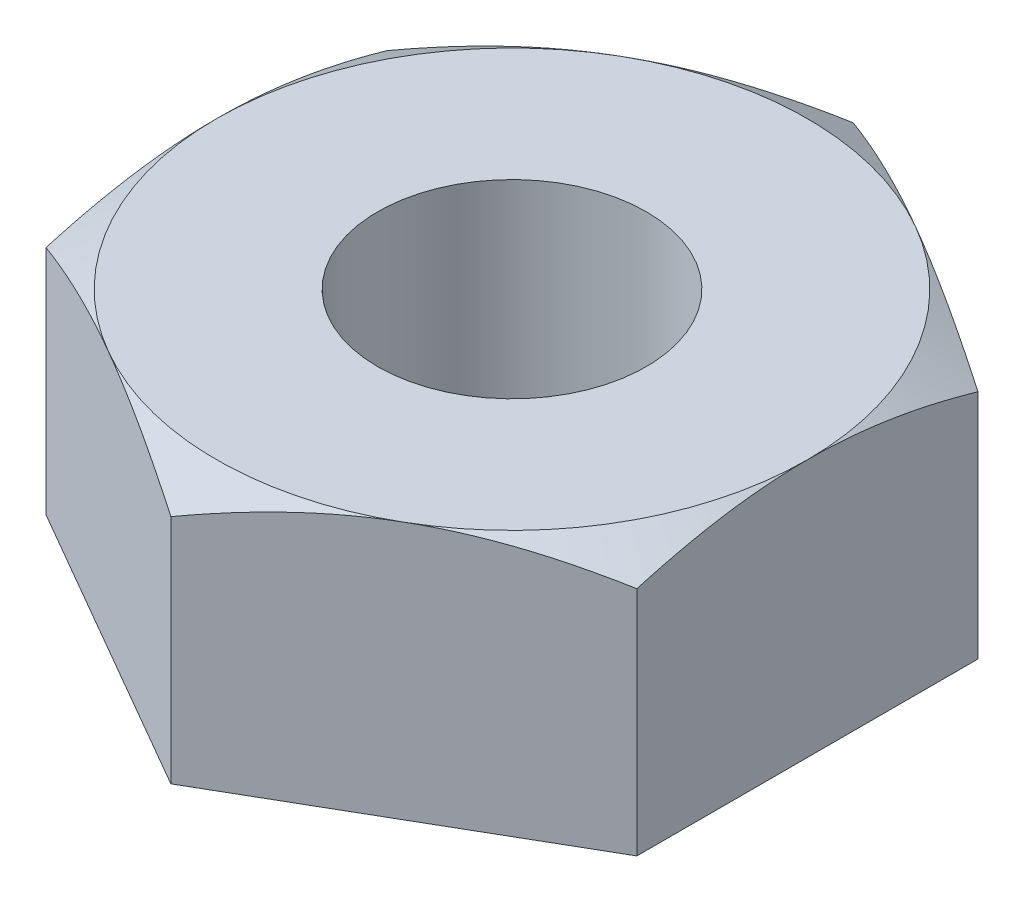
ISO-10303-21;
HEADER;
FILE_DESCRIPTION(('STEP AP214'),'2;1');
FILE_NAME('part.step','',(''),(''),'','','');
FILE_SCHEMA(('AUTOMOTIVE_DESIGN { 1 0 10303 214 1 1 1 1 }'));
ENDSEC;
DATA;
#1=APPLICATION_CONTEXT('core data for automotive mechanical design processes');
#2=APPLICATION_PROTOCOL_DEFINITION('international standard','automotive_design',2000,#1);
#3=PRODUCT_CONTEXT('',#1,'mechanical');
#4=PRODUCT('Part','Part','',(#3));
#5=PRODUCT_RELATED_PRODUCT_CATEGORY('part','',(#4));
#6=PRODUCT_DEFINITION_FORMATION('','',#4);
#7=PRODUCT_DEFINITION_CONTEXT('part definition',#1,'design');
#8=PRODUCT_DEFINITION('design','',#6,#7);
#9=PRODUCT_DEFINITION_SHAPE('','',#8);
#10=(LENGTH_UNIT() NAMED_UNIT(*) SI_UNIT(.MILLI.,.METRE.));
#11=(NAMED_UNIT(*) PLANE_ANGLE_UNIT() SI_UNIT($,.RADIAN.));
#12=(NAMED_UNIT(*) SI_UNIT($,.STERADIAN.) SOLID_ANGLE_UNIT());
#13=UNCERTAINTY_MEASURE_WITH_UNIT(LENGTH_MEASURE(1.E-05),#10,'distance_accuracy_value','');
#14=(GEOMETRIC_REPRESENTATION_CONTEXT(3) GLOBAL_UNCERTAINTY_ASSIGNED_CONTEXT((#13)) GLOBAL_UNIT_ASSIGNED_CONTEXT((#10,
#11,#12)) REPRESENTATION_CONTEXT('',''));
#15=CARTESIAN_POINT('',(0.,0.,0.));
#16=DIRECTION('',(0.,0.,1.));
#17=DIRECTION('',(1.,0.,0.));
#18=AXIS2_PLACEMENT_3D('',#15,#16,#17);
#19=CARTESIAN_POINT('',(2.75,-2.4,-1.58771324027147));
#20=DIRECTION('',(0.5,0.,-0.866025403784439));
#21=DIRECTION('',(-0.866025403784439,0.,-0.5));
#22=AXIS2_PLACEMENT_3D('',#19,#20,#21);
#23=PLANE('',#22);
#24=DIRECTION('',(0.,1.,0.));
#25=VECTOR('',#24,1.);
#26=CARTESIAN_POINT('',(0.,-2.4,-3.17542648054294));
#27=LINE('',#26,#25);
#28=CARTESIAN_POINT('',(0.,-2.4,-3.17542648054294));
#29=VERTEX_POINT('',#28);
#30=CARTESIAN_POINT('',(0.,-0.245620093061859,-3.17542648054294));
#31=VERTEX_POINT('',#30);
#32=EDGE_CURVE('E143',#29,#31,#27,.T.);
#33=ORIENTED_EDGE('',*,*,#32,.T.);
#34=CARTESIAN_POINT('',(-0.000199999999999868,-0.245686763364757,-3.17554195059678));
#35=CARTESIAN_POINT('',(0.120649220659906,-0.205387662249261,-3.10576962051743));
#36=CARTESIAN_POINT('',(0.242541602622634,-0.16873690259766,-3.03539502097908));
#37=CARTESIAN_POINT('',(0.488437126727892,-0.1047621829698,-2.89342717394439));
#38=CARTESIAN_POINT('',(0.612444638573855,-0.0774608556744965,-2.82183140359858));
#39=CARTESIAN_POINT('',(0.858922797975943,-0.0349617452941164,-2.67952717191843));
#40=CARTESIAN_POINT('',(0.981355518587416,-0.0194811186224576,-2.60884060771577));
#41=CARTESIAN_POINT('',(1.22679714236891,-0.000999397369940595,-2.46713482015519));
#42=CARTESIAN_POINT('',(1.34980515323291,0.00201700053740013,-2.39611611197038));
#43=CARTESIAN_POINT('',(1.57965878661079,-0.00425314542854663,-2.26341005486544));
#44=CARTESIAN_POINT('',(1.68653879125402,-0.0120001542767021,-2.20170285541369));
#45=CARTESIAN_POINT('',(1.89960246733475,-0.0365551810643541,-2.07869048467395));
#46=CARTESIAN_POINT('',(2.00578540164889,-0.0533715896505694,-2.01738573896434));
#47=CARTESIAN_POINT('',(2.21928848939318,-0.0954119223459548,-1.89411967378235));
#48=CARTESIAN_POINT('',(2.32658161614285,-0.120814080687229,-1.83217395817123));
#49=CARTESIAN_POINT('',(2.53956747928405,-0.178467225839979,-1.70920651275308));
#50=CARTESIAN_POINT('',(2.64526294502665,-0.210704663298979,-1.64818320715446));
#51=CARTESIAN_POINT('',(2.7502,-0.245686763364757,-1.58759777021763));
#52=B_SPLINE_CURVE_WITH_KNOTS('',3,(#34,#35,#36,#37,#38,#39,#40,#41,#42,#43,#44,#45,#46,#47,#48,
#49,#50,#51),.UNSPECIFIED.,.F.,.F.,(4,2,2,2,2,2,2,2,4),(0.,0.435912828725888,0.872873557116331,
1.29901931904671,1.72464171213573,2.09526089052937,2.46622354066374,2.84541551798557,
3.22386274754524),.UNSPECIFIED.);
#53=CARTESIAN_POINT('',(1.375,0.,-2.38156986040721));
#54=VERTEX_POINT('',#53);
#55=EDGE_CURVE('E59',#31,#54,#52,.T.);
#56=ORIENTED_EDGE('',*,*,#55,.T.);
#57=CARTESIAN_POINT('',(2.75,-0.245620093061859,-1.58771324027147));
#58=VERTEX_POINT('',#57);
#59=EDGE_CURVE('E222',#54,#58,#52,.T.);
#60=ORIENTED_EDGE('',*,*,#59,.T.);
#61=DIRECTION('',(0.,1.,0.));
#62=VECTOR('',#61,1.);
#63=CARTESIAN_POINT('',(2.75,-2.4,-1.58771324027147));
#64=LINE('',#63,#62);
#65=CARTESIAN_POINT('',(2.75,-2.4,-1.58771324027147));
#66=VERTEX_POINT('',#65);
#67=EDGE_CURVE('E135',#66,#58,#64,.T.);
#68=ORIENTED_EDGE('',*,*,#67,.F.);
#69=DIRECTION('',(-0.866025403784439,0.,-0.5));
#70=VECTOR('',#69,1.);
#71=CARTESIAN_POINT('',(2.75,-2.4,-1.58771324027147));
#72=LINE('',#71,#70);
#73=EDGE_CURVE('E350',#66,#29,#72,.T.);
#74=ORIENTED_EDGE('',*,*,#73,.T.);
#75=EDGE_LOOP('',(#33,#56,#60,#68,#74));
#76=FACE_BOUND('',#75,.T.);
#77=ADVANCED_FACE('F35',(#76),#23,.T.);
#78=CARTESIAN_POINT('',(2.75,-2.4,1.58771324027147));
#79=DIRECTION('',(1.,0.,0.));
#80=DIRECTION('',(0.,0.,-1.));
#81=AXIS2_PLACEMENT_3D('',#78,#79,#80);
#82=PLANE('',#81);
#83=ORIENTED_EDGE('',*,*,#67,.T.);
#84=CARTESIAN_POINT('',(2.75,-1.31594843960292,-4.21084949309676));
#85=CARTESIAN_POINT('',(2.75,-1.25759993615222,-4.0901089421409));
#86=CARTESIAN_POINT('',(2.75,-1.19983146511756,-3.96908292065509));
#87=CARTESIAN_POINT('',(2.75,-1.08578603842303,-3.72630558284843));
#88=CARTESIAN_POINT('',(2.75,-1.02950934100245,-3.604554145362));
#89=CARTESIAN_POINT('',(2.75,-0.918482443352741,-3.35951393034354));
#90=CARTESIAN_POINT('',(2.75,-0.863742821605822,-3.23622034236436));
#91=CARTESIAN_POINT('',(2.75,-0.75661477747644,-2.98861980138743));
#92=CARTESIAN_POINT('',(2.75,-0.704226232536751,-2.86431290161182));
#93=CARTESIAN_POINT('',(2.75,-0.601803572146113,-2.61294485887172));
#94=CARTESIAN_POINT('',(2.75,-0.551806257898383,-2.48586863815654));
#95=CARTESIAN_POINT('',(2.75,-0.455727408784592,-2.2302173217154));
#96=CARTESIAN_POINT('',(2.75,-0.409646309576964,-2.10164206103363));
#97=CARTESIAN_POINT('',(2.75,-0.322638077046225,-1.84305218799467));
#98=CARTESIAN_POINT('',(2.75,-0.281699986413882,-1.71304130052583));
#99=CARTESIAN_POINT('',(2.75,-0.206307307624344,-1.45117125062147));
#100=CARTESIAN_POINT('',(2.75,-0.171850669152763,-1.31931268690202));
#101=CARTESIAN_POINT('',(2.75,-0.111093671530901,-1.05365722480012));
#102=CARTESIAN_POINT('',(2.75,-0.0847954840951196,-0.91985982021759));
#103=CARTESIAN_POINT('',(2.75,-0.0421260371966102,-0.65065187403738));
#104=CARTESIAN_POINT('',(2.75,-0.0257547865105424,-0.515241331013594));
#105=CARTESIAN_POINT('',(2.75,-0.00438749654023712,-0.244373242869211));
#106=CARTESIAN_POINT('',(2.75,0.000680556773216223,-0.108921526377134));
#107=CARTESIAN_POINT('',(2.75,-0.00082779563267177,0.161887058855133));
#108=CARTESIAN_POINT('',(2.75,-0.00740117868555346,0.297243943089639));
#109=CARTESIAN_POINT('',(2.75,-0.0281041300468431,0.528385436717542));
#110=CARTESIAN_POINT('',(2.75,-0.0395376410301874,0.624425050137502));
#111=CARTESIAN_POINT('',(2.75,-0.0675217196133503,0.815762399811549));
#112=CARTESIAN_POINT('',(2.75,-0.0840730942276818,0.911060016631973));
#113=CARTESIAN_POINT('',(2.75,-0.140535361278285,1.19576218748918));
#114=CARTESIAN_POINT('',(2.75,-0.187239859417295,1.38383224738498));
#115=CARTESIAN_POINT('',(2.75,-0.26779249703058,1.66525048947487));
#116=CARTESIAN_POINT('',(2.75,-0.296803334995503,1.7600655624856));
#117=CARTESIAN_POINT('',(2.75,-0.357695648906591,1.94870609382218));
#118=CARTESIAN_POINT('',(2.75,-0.389575144878507,2.04253218553699));
#119=CARTESIAN_POINT('',(2.75,-0.455541418186453,2.22880240354988));
#120=CARTESIAN_POINT('',(2.75,-0.489614761455538,2.32125133588455));
#121=CARTESIAN_POINT('',(2.75,-0.559761368231115,2.50543192042632));
#122=CARTESIAN_POINT('',(2.75,-0.595835440037324,2.59716326539583));
#123=CARTESIAN_POINT('',(2.75,-0.63271244199749,2.6885629305335));
#124=B_SPLINE_CURVE_WITH_KNOTS('',3,(#84,#85,#86,#87,#88,#89,#90,#91,#92,#93,#94,#95,#96,#97,
#98,#99,#100,#101,#102,#103,#104,#105,#106,#107,#108,#109,#110,#111,#112,#113,#114,#115,#116,
#117,#118,#119,#120,#121,#122,#123),.UNSPECIFIED.,.F.,.F.,(4,2,2,2,2,2,2,2,2,2,2,2,2,2,2,2,2,2,
2,4),(0.,0.402305607365936,0.804680408536995,1.20935783819118,1.61401414820818,2.02363838185769,
2.43330812457348,2.842089694796,3.25074173456635,3.65950246109142,4.06826354901183,
4.47441284024649,4.8804566914117,5.17046846817545,5.46052599902452,6.04107275309884,
6.33851131304663,6.63574613017457,6.93130791005795,7.22698998004826),.UNSPECIFIED.);
#125=CARTESIAN_POINT('',(2.75,0.,0.));
#126=VERTEX_POINT('',#125);
#127=EDGE_CURVE('E221',#58,#126,#124,.T.);
#128=ORIENTED_EDGE('',*,*,#127,.T.);
#129=CARTESIAN_POINT('',(2.75,-0.245620093061859,1.58771324027147));
#130=VERTEX_POINT('',#129);
#131=EDGE_CURVE('E215',#126,#130,#124,.T.);
#132=ORIENTED_EDGE('',*,*,#131,.T.);
#133=DIRECTION('',(0.,1.,0.));
#134=VECTOR('',#133,1.);
#135=CARTESIAN_POINT('',(2.75,-2.4,1.58771324027147));
#136=LINE('',#135,#134);
#137=CARTESIAN_POINT('',(2.75,-2.4,1.58771324027147));
#138=VERTEX_POINT('',#137);
#139=EDGE_CURVE('E132',#138,#130,#136,.T.);
#140=ORIENTED_EDGE('',*,*,#139,.F.);
#141=DIRECTION('',(0.,0.,-1.));
#142=VECTOR('',#141,1.);
#143=CARTESIAN_POINT('',(2.75,-2.4,1.58771324027147));
#144=LINE('',#143,#142);
#145=EDGE_CURVE('E145',#138,#66,#144,.T.);
#146=ORIENTED_EDGE('',*,*,#145,.T.);
#147=EDGE_LOOP('',(#83,#128,#132,#140,#146));
#148=FACE_BOUND('',#147,.T.);
#149=ADVANCED_FACE('F227',(#148),#82,.T.);
#150=CARTESIAN_POINT('',(0.,-2.4,3.17542648054294));
#151=DIRECTION('',(0.5,0.,0.866025403784439));
#152=DIRECTION('',(0.866025403784439,0.,-0.5));
#153=AXIS2_PLACEMENT_3D('',#150,#151,#152);
#154=PLANE('',#153);
#155=ORIENTED_EDGE('',*,*,#139,.T.);
#156=CARTESIAN_POINT('',(2.7502,-0.245686763364757,1.58759777021763));
#157=CARTESIAN_POINT('',(2.62935077934009,-0.20538766224926,1.65737010029699));
#158=CARTESIAN_POINT('',(2.50745839737737,-0.16873690259766,1.72774469983533));
#159=CARTESIAN_POINT('',(2.26156287327211,-0.104762182969799,1.86971254687003));
#160=CARTESIAN_POINT('',(2.13755536142614,-0.0774608556744959,1.94130831721583));
#161=CARTESIAN_POINT('',(1.89107720202406,-0.0349617452941157,2.08361254889599));
#162=CARTESIAN_POINT('',(1.76864448141258,-0.0194811186224568,2.15429911309864));
#163=CARTESIAN_POINT('',(1.52320285763109,-0.000999397369939674,2.29600490065923));
#164=CARTESIAN_POINT('',(1.40019484676709,0.00201700053740103,2.36702360884403));
#165=CARTESIAN_POINT('',(1.17034121338921,-0.00425314542854578,2.49972966594897));
#166=CARTESIAN_POINT('',(1.06346120874598,-0.0120001542767013,2.56143686540072));
#167=CARTESIAN_POINT('',(0.850397532665251,-0.0365551810643533,2.68444923614046));
#168=CARTESIAN_POINT('',(0.744214598351111,-0.0533715896505687,2.74575398185008));
#169=CARTESIAN_POINT('',(0.530711510606816,-0.0954119223459542,2.86902004703206));
#170=CARTESIAN_POINT('',(0.423418383857145,-0.120814080687228,2.93096576264318));
#171=CARTESIAN_POINT('',(0.210432520715948,-0.178467225839979,3.05393320806134));
#172=CARTESIAN_POINT('',(0.104737054973347,-0.210704663298979,3.11495651365995));
#173=CARTESIAN_POINT('',(-0.000200000000001054,-0.245686763364756,3.17554195059678));
#174=B_SPLINE_CURVE_WITH_KNOTS('',3,(#156,#157,#158,#159,#160,#161,#162,#163,#164,#165,#166,
#167,#168,#169,#170,#171,#172,#173),.UNSPECIFIED.,.F.,.F.,(4,2,2,2,2,2,2,2,4),(0.,
0.435912828725887,0.87287355711633,1.29901931904671,1.72464171213573,2.09526089052937,
2.46622354066374,2.84541551798557,3.22386274754524),.UNSPECIFIED.);
#175=CARTESIAN_POINT('',(1.375,0.,2.38156986040721));
#176=VERTEX_POINT('',#175);
#177=EDGE_CURVE('E126',#130,#176,#174,.T.);
#178=ORIENTED_EDGE('',*,*,#177,.T.);
#179=CARTESIAN_POINT('',(0.,-0.245620093061859,3.17542648054294));
#180=VERTEX_POINT('',#179);
#181=EDGE_CURVE('E111',#176,#180,#174,.T.);
#182=ORIENTED_EDGE('',*,*,#181,.T.);
#183=DIRECTION('',(0.,1.,0.));
#184=VECTOR('',#183,1.);
#185=CARTESIAN_POINT('',(0.,-2.4,3.17542648054294));
#186=LINE('',#185,#184);
#187=CARTESIAN_POINT('',(0.,-2.4,3.17542648054294));
#188=VERTEX_POINT('',#187);
#189=EDGE_CURVE('E124',#188,#180,#186,.T.);
#190=ORIENTED_EDGE('',*,*,#189,.F.);
#191=DIRECTION('',(0.866025403784439,0.,-0.5));
#192=VECTOR('',#191,1.);
#193=CARTESIAN_POINT('',(0.,-2.4,3.17542648054294));
#194=LINE('',#193,#192);
#195=EDGE_CURVE('E149',#188,#138,#194,.T.);
#196=ORIENTED_EDGE('',*,*,#195,.T.);
#197=EDGE_LOOP('',(#155,#178,#182,#190,#196));
#198=FACE_BOUND('',#197,.T.);
#199=ADVANCED_FACE('F122',(#198),#154,.T.);
#200=CARTESIAN_POINT('',(-2.75,-2.4,1.58771324027147));
#201=DIRECTION('',(-0.5,0.,0.866025403784439));
#202=DIRECTION('',(0.866025403784439,0.,0.5));
#203=AXIS2_PLACEMENT_3D('',#200,#201,#202);
#204=PLANE('',#203);
#205=ORIENTED_EDGE('',*,*,#189,.T.);
#206=CARTESIAN_POINT('',(0.000199999999998931,-0.245686763364756,3.17554195059678));
#207=CARTESIAN_POINT('',(-0.120649220659907,-0.20538766224926,3.10576962051743));
#208=CARTESIAN_POINT('',(-0.242541602622635,-0.16873690259766,3.03539502097908));
#209=CARTESIAN_POINT('',(-0.488437126727893,-0.104762182969799,2.89342717394438));
#210=CARTESIAN_POINT('',(-0.612444638573856,-0.0774608556744956,2.82183140359858));
#211=CARTESIAN_POINT('',(-0.858922797975944,-0.0349617452941155,2.67952717191842));
#212=CARTESIAN_POINT('',(-0.981355518587417,-0.0194811186224569,2.60884060771577));
#213=CARTESIAN_POINT('',(-1.22679714236891,-0.000999397369939882,2.46713482015518));
#214=CARTESIAN_POINT('',(-1.34980515323291,0.00201700053740086,2.39611611197038));
#215=CARTESIAN_POINT('',(-1.57965878661079,-0.00425314542854587,2.26341005486544));
#216=CARTESIAN_POINT('',(-1.68653879125402,-0.0120001542767013,2.20170285541369));
#217=CARTESIAN_POINT('',(-1.89960246733475,-0.0365551810643535,2.07869048467395));
#218=CARTESIAN_POINT('',(-2.00578540164889,-0.0533715896505689,2.01738573896433));
#219=CARTESIAN_POINT('',(-2.21928848939318,-0.0954119223459544,1.89411967378235));
#220=CARTESIAN_POINT('',(-2.32658161614285,-0.120814080687228,1.83217395817123));
#221=CARTESIAN_POINT('',(-2.53956747928405,-0.178467225839979,1.70920651275307));
#222=CARTESIAN_POINT('',(-2.64526294502665,-0.210704663298979,1.64818320715446));
#223=CARTESIAN_POINT('',(-2.7502,-0.245686763364756,1.58759777021763));
#224=B_SPLINE_CURVE_WITH_KNOTS('',3,(#206,#207,#208,#209,#210,#211,#212,#213,#214,#215,#216,
#217,#218,#219,#220,#221,#222,#223),.UNSPECIFIED.,.F.,.F.,(4,2,2,2,2,2,2,2,4),(0.,
0.435912828725887,0.87287355711633,1.29901931904671,1.72464171213573,2.09526089052937,
2.46622354066374,2.84541551798557,3.22386274754524),.UNSPECIFIED.);
#225=CARTESIAN_POINT('',(-1.375,0.,2.38156986040721));
#226=VERTEX_POINT('',#225);
#227=EDGE_CURVE('E108',#180,#226,#224,.T.);
#228=ORIENTED_EDGE('',*,*,#227,.T.);
#229=CARTESIAN_POINT('',(-2.75,-0.245620093061859,1.58771324027147));
#230=VERTEX_POINT('',#229);
#231=EDGE_CURVE('E117',#226,#230,#224,.T.);
#232=ORIENTED_EDGE('',*,*,#231,.T.);
#233=DIRECTION('',(0.,1.,0.));
#234=VECTOR('',#233,1.);
#235=CARTESIAN_POINT('',(-2.75,-2.4,1.58771324027147));
#236=LINE('',#235,#234);
#237=CARTESIAN_POINT('',(-2.75,-2.4,1.58771324027147));
#238=VERTEX_POINT('',#237);
#239=EDGE_CURVE('E133',#238,#230,#236,.T.);
#240=ORIENTED_EDGE('',*,*,#239,.F.);
#241=DIRECTION('',(0.866025403784439,0.,0.5));
#242=VECTOR('',#241,1.);
#243=CARTESIAN_POINT('',(-2.75,-2.4,1.58771324027147));
#244=LINE('',#243,#242);
#245=EDGE_CURVE('E131',#238,#188,#244,.T.);
#246=ORIENTED_EDGE('',*,*,#245,.T.);
#247=EDGE_LOOP('',(#205,#228,#232,#240,#246));
#248=FACE_BOUND('',#247,.T.);
#249=ADVANCED_FACE('F129',(#248),#204,.T.);
#250=CARTESIAN_POINT('',(-2.75,-2.4,-1.58771324027147));
#251=DIRECTION('',(-1.,0.,0.));
#252=DIRECTION('',(0.,0.,1.));
#253=AXIS2_PLACEMENT_3D('',#250,#251,#252);
#254=PLANE('',#253);
#255=ORIENTED_EDGE('',*,*,#239,.T.);
#256=CARTESIAN_POINT('',(-2.75,-1.31594843960292,-4.21084949309676));
#257=CARTESIAN_POINT('',(-2.75,-1.25759993615222,-4.0901089421409));
#258=CARTESIAN_POINT('',(-2.75,-1.19983146511756,-3.96908292065509));
#259=CARTESIAN_POINT('',(-2.75,-1.08578603842303,-3.72630558284843));
#260=CARTESIAN_POINT('',(-2.75,-1.02950934100245,-3.604554145362));
#261=CARTESIAN_POINT('',(-2.75,-0.918482443352742,-3.35951393034354));
#262=CARTESIAN_POINT('',(-2.75,-0.863742821605823,-3.23622034236436));
#263=CARTESIAN_POINT('',(-2.75,-0.756614777476441,-2.98861980138743));
#264=CARTESIAN_POINT('',(-2.75,-0.704226232536751,-2.86431290161182));
#265=CARTESIAN_POINT('',(-2.75,-0.601803572146113,-2.61294485887172));
#266=CARTESIAN_POINT('',(-2.75,-0.551806257898383,-2.48586863815654));
#267=CARTESIAN_POINT('',(-2.75,-0.455727408784592,-2.2302173217154));
#268=CARTESIAN_POINT('',(-2.75,-0.409646309576964,-2.10164206103363));
#269=CARTESIAN_POINT('',(-2.75,-0.322638077046225,-1.84305218799467));
#270=CARTESIAN_POINT('',(-2.75,-0.281699986413883,-1.71304130052583));
#271=CARTESIAN_POINT('',(-2.75,-0.206307307624344,-1.45117125062147));
#272=CARTESIAN_POINT('',(-2.75,-0.171850669152764,-1.31931268690202));
#273=CARTESIAN_POINT('',(-2.75,-0.111093671530902,-1.05365722480012));
#274=CARTESIAN_POINT('',(-2.75,-0.0847954840951196,-0.91985982021759));
#275=CARTESIAN_POINT('',(-2.75,-0.0421260371966102,-0.65065187403738));
#276=CARTESIAN_POINT('',(-2.75,-0.0257547865105425,-0.515241331013594));
#277=CARTESIAN_POINT('',(-2.75,-0.00438749654023747,-0.244373242869211));
#278=CARTESIAN_POINT('',(-2.75,0.000680556773215849,-0.108921526377134));
#279=CARTESIAN_POINT('',(-2.75,-0.000827795632671897,0.161887058855133));
#280=CARTESIAN_POINT('',(-2.75,-0.00740117868555331,0.297243943089639));
#281=CARTESIAN_POINT('',(-2.75,-0.0281041300468432,0.528385436717542));
#282=CARTESIAN_POINT('',(-2.75,-0.0395376410301878,0.624425050137502));
#283=CARTESIAN_POINT('',(-2.75,-0.0675217196133508,0.815762399811549));
#284=CARTESIAN_POINT('',(-2.75,-0.0840730942276822,0.911060016631973));
#285=CARTESIAN_POINT('',(-2.75,-0.140535361278285,1.19576218748918));
#286=CARTESIAN_POINT('',(-2.75,-0.187239859417295,1.38383224738498));
#287=CARTESIAN_POINT('',(-2.75,-0.267792497030581,1.66525048947487));
#288=CARTESIAN_POINT('',(-2.75,-0.296803334995504,1.7600655624856));
#289=CARTESIAN_POINT('',(-2.75,-0.357695648906591,1.94870609382218));
#290=CARTESIAN_POINT('',(-2.75,-0.389575144878507,2.04253218553699));
#291=CARTESIAN_POINT('',(-2.75,-0.455541418186453,2.22880240354988));
#292=CARTESIAN_POINT('',(-2.75,-0.489614761455538,2.32125133588455));
#293=CARTESIAN_POINT('',(-2.75,-0.559761368231115,2.50543192042633));
#294=CARTESIAN_POINT('',(-2.75,-0.595835440037325,2.59716326539583));
#295=CARTESIAN_POINT('',(-2.75,-0.632712441997491,2.6885629305335));
#296=B_SPLINE_CURVE_WITH_KNOTS('',3,(#256,#257,#258,#259,#260,#261,#262,#263,#264,#265,#266,
#267,#268,#269,#270,#271,#272,#273,#274,#275,#276,#277,#278,#279,#280,#281,#282,#283,#284,#285,
#286,#287,#288,#289,#290,#291,#292,#293,#294,#295),.UNSPECIFIED.,.F.,.F.,(4,2,2,2,2,2,2,2,2,2,2,
2,2,2,2,2,2,2,2,4),(0.,0.402305607365936,0.804680408536995,1.20935783819118,1.61401414820818,
2.02363838185769,2.43330812457348,2.842089694796,3.25074173456636,3.65950246109143,
4.06826354901183,4.47441284024649,4.88045669141171,5.17046846817545,5.46052599902452,
6.04107275309884,6.33851131304663,6.63574613017457,6.93130791005795,7.22698998004826),.UNSPECIFIED.);
#297=CARTESIAN_POINT('',(-2.75,0.,0.));
#298=VERTEX_POINT('',#297);
#299=EDGE_CURVE('E177',#230,#298,#296,.F.);
#300=ORIENTED_EDGE('',*,*,#299,.T.);
#301=CARTESIAN_POINT('',(-2.75,-0.245620093061859,-1.58771324027147));
#302=VERTEX_POINT('',#301);
#303=EDGE_CURVE('E175',#298,#302,#296,.F.);
#304=ORIENTED_EDGE('',*,*,#303,.T.);
#305=DIRECTION('',(0.,1.,0.));
#306=VECTOR('',#305,1.);
#307=CARTESIAN_POINT('',(-2.75,-2.4,-1.58771324027147));
#308=LINE('',#307,#306);
#309=CARTESIAN_POINT('',(-2.75,-2.4,-1.58771324027147));
#310=VERTEX_POINT('',#309);
#311=EDGE_CURVE('E138',#310,#302,#308,.T.);
#312=ORIENTED_EDGE('',*,*,#311,.F.);
#313=DIRECTION('',(0.,0.,1.));
#314=VECTOR('',#313,1.);
#315=CARTESIAN_POINT('',(-2.75,-2.4,-1.58771324027147));
#316=LINE('',#315,#314);
#317=EDGE_CURVE('E353',#310,#238,#316,.T.);
#318=ORIENTED_EDGE('',*,*,#317,.T.);
#319=EDGE_LOOP('',(#255,#300,#304,#312,#318));
#320=FACE_BOUND('',#319,.T.);
#321=ADVANCED_FACE('F234',(#320),#254,.T.);
#322=CARTESIAN_POINT('',(0.,-2.4,-3.17542648054294));
#323=DIRECTION('',(-0.5,0.,-0.866025403784439));
#324=DIRECTION('',(-0.866025403784439,0.,0.5));
#325=AXIS2_PLACEMENT_3D('',#322,#323,#324);
#326=PLANE('',#325);
#327=ORIENTED_EDGE('',*,*,#311,.T.);
#328=CARTESIAN_POINT('',(-2.7502,-0.245686763364757,-1.58759777021763));
#329=CARTESIAN_POINT('',(-2.62935077934009,-0.20538766224926,-1.65737010029699));
#330=CARTESIAN_POINT('',(-2.50745839737737,-0.16873690259766,-1.72774469983533));
#331=CARTESIAN_POINT('',(-2.26156287327211,-0.104762182969799,-1.86971254687003));
#332=CARTESIAN_POINT('',(-2.13755536142614,-0.0774608556744963,-1.94130831721583));
#333=CARTESIAN_POINT('',(-1.89107720202406,-0.0349617452941164,-2.08361254889599));
#334=CARTESIAN_POINT('',(-1.76864448141258,-0.0194811186224576,-2.15429911309864));
#335=CARTESIAN_POINT('',(-1.52320285763109,-0.000999397369940391,-2.29600490065923));
#336=CARTESIAN_POINT('',(-1.40019484676709,0.00201700053740046,-2.36702360884404));
#337=CARTESIAN_POINT('',(-1.17034121338921,-0.00425314542854646,-2.49972966594897));
#338=CARTESIAN_POINT('',(-1.06346120874598,-0.0120001542767021,-2.56143686540073));
#339=CARTESIAN_POINT('',(-0.850397532665251,-0.0365551810643543,-2.68444923614047));
#340=CARTESIAN_POINT('',(-0.744214598351111,-0.0533715896505695,-2.74575398185008));
#341=CARTESIAN_POINT('',(-0.530711510606817,-0.095411922345955,-2.86902004703206));
#342=CARTESIAN_POINT('',(-0.423418383857145,-0.120814080687229,-2.93096576264318));
#343=CARTESIAN_POINT('',(-0.210432520715949,-0.17846722583998,-3.05393320806134));
#344=CARTESIAN_POINT('',(-0.104737054973347,-0.21070466329898,-3.11495651365995));
#345=CARTESIAN_POINT('',(0.00020000000000027,-0.245686763364757,-3.17554195059678));
#346=B_SPLINE_CURVE_WITH_KNOTS('',3,(#328,#329,#330,#331,#332,#333,#334,#335,#336,#337,#338,
#339,#340,#341,#342,#343,#344,#345),.UNSPECIFIED.,.F.,.F.,(4,2,2,2,2,2,2,2,4),(0.,
0.435912828725888,0.872873557116331,1.29901931904671,1.72464171213573,2.09526089052937,
2.46622354066374,2.84541551798557,3.22386274754524),.UNSPECIFIED.);
#347=CARTESIAN_POINT('',(-1.375,0.,-2.38156986040721));
#348=VERTEX_POINT('',#347);
#349=EDGE_CURVE('E169',#302,#348,#346,.T.);
#350=ORIENTED_EDGE('',*,*,#349,.T.);
#351=EDGE_CURVE('E171',#348,#31,#346,.T.);
#352=ORIENTED_EDGE('',*,*,#351,.T.);
#353=ORIENTED_EDGE('',*,*,#32,.F.);
#354=DIRECTION('',(-0.866025403784439,0.,0.5));
#355=VECTOR('',#354,1.);
#356=CARTESIAN_POINT('',(0.,-2.4,-3.17542648054294));
#357=LINE('',#356,#355);
#358=EDGE_CURVE('E351',#29,#310,#357,.T.);
#359=ORIENTED_EDGE('',*,*,#358,.T.);
#360=EDGE_LOOP('',(#327,#350,#352,#353,#359));
#361=FACE_BOUND('',#360,.T.);
#362=ADVANCED_FACE('F170',(#361),#326,.T.);
#363=CARTESIAN_POINT('',(0.,-2.4,0.));
#364=DIRECTION('',(0.,1.,0.));
#365=DIRECTION('',(0.,0.,1.));
#366=AXIS2_PLACEMENT_3D('',#363,#364,#365);
#367=PLANE('',#366);
#368=CARTESIAN_POINT('',(0.,-2.4,0.));
#369=DIRECTION('',(0.,1.,0.));
#370=DIRECTION('',(0.,0.,1.));
#371=AXIS2_PLACEMENT_3D('',#368,#369,#370);
#372=CIRCLE('',#371,1.25);
#373=CARTESIAN_POINT('',(0.,-2.4,1.25));
#374=VERTEX_POINT('',#373);
#375=EDGE_CURVE('E344',#374,#374,#372,.T.);
#376=ORIENTED_EDGE('',*,*,#375,.T.);
#377=EDGE_LOOP('',(#376));
#378=FACE_BOUND('',#377,.T.);
#379=ORIENTED_EDGE('',*,*,#73,.F.);
#380=ORIENTED_EDGE('',*,*,#145,.F.);
#381=ORIENTED_EDGE('',*,*,#195,.F.);
#382=ORIENTED_EDGE('',*,*,#245,.F.);
#383=ORIENTED_EDGE('',*,*,#317,.F.);
#384=ORIENTED_EDGE('',*,*,#358,.F.);
#385=EDGE_LOOP('',(#379,#380,#381,#382,#383,#384));
#386=FACE_BOUND('',#385,.T.);
#387=ADVANCED_FACE('F198',(#378,#386),#367,.F.);
#388=CARTESIAN_POINT('',(0.,0.,0.));
#389=DIRECTION('',(0.,-1.,0.));
#390=DIRECTION('',(0.,0.,-1.));
#391=AXIS2_PLACEMENT_3D('',#388,#389,#390);
#392=CONICAL_SURFACE('',#391,2.75,1.0471975511966);
#393=CARTESIAN_POINT('',(0.,0.,0.));
#394=DIRECTION('',(0.,1.,0.));
#395=DIRECTION('',(0.,0.,1.));
#396=AXIS2_PLACEMENT_3D('',#393,#394,#395);
#397=CIRCLE('',#396,2.75);
#398=EDGE_CURVE('E39',#226,#176,#397,.T.);
#399=ORIENTED_EDGE('',*,*,#398,.F.);
#400=ORIENTED_EDGE('',*,*,#227,.F.);
#401=ORIENTED_EDGE('',*,*,#181,.F.);
#402=EDGE_LOOP('',(#399,#400,#401));
#403=FACE_BOUND('',#402,.T.);
#404=ADVANCED_FACE('F110',(#403),#392,.T.);
#405=EDGE_CURVE('E157',#298,#226,#397,.T.);
#406=ORIENTED_EDGE('',*,*,#405,.F.);
#407=ORIENTED_EDGE('',*,*,#299,.F.);
#408=ORIENTED_EDGE('',*,*,#231,.F.);
#409=EDGE_LOOP('',(#406,#407,#408));
#410=FACE_BOUND('',#409,.T.);
#411=ADVANCED_FACE('F196',(#410),#392,.T.);
#412=EDGE_CURVE('E159',#348,#298,#397,.T.);
#413=ORIENTED_EDGE('',*,*,#412,.F.);
#414=ORIENTED_EDGE('',*,*,#349,.F.);
#415=ORIENTED_EDGE('',*,*,#303,.F.);
#416=EDGE_LOOP('',(#413,#414,#415));
#417=FACE_BOUND('',#416,.T.);
#418=ADVANCED_FACE('F190',(#417),#392,.T.);
#419=ORIENTED_EDGE('',*,*,#351,.F.);
#420=EDGE_CURVE('E44',#54,#348,#397,.T.);
#421=ORIENTED_EDGE('',*,*,#420,.F.);
#422=ORIENTED_EDGE('',*,*,#55,.F.);
#423=EDGE_LOOP('',(#419,#421,#422));
#424=FACE_BOUND('',#423,.T.);
#425=ADVANCED_FACE('F195',(#424),#392,.T.);
#426=EDGE_CURVE('E11',#126,#54,#397,.T.);
#427=ORIENTED_EDGE('',*,*,#426,.F.);
#428=ORIENTED_EDGE('',*,*,#127,.F.);
#429=ORIENTED_EDGE('',*,*,#59,.F.);
#430=EDGE_LOOP('',(#427,#428,#429));
#431=FACE_BOUND('',#430,.T.);
#432=ADVANCED_FACE('F299',(#431),#392,.T.);
#433=CARTESIAN_POINT('',(0.,0.,0.));
#434=DIRECTION('',(0.,1.,0.));
#435=DIRECTION('',(0.,0.,1.));
#436=AXIS2_PLACEMENT_3D('',#433,#434,#435);
#437=CIRCLE('',#436,2.75);
#438=EDGE_CURVE('E51',#176,#126,#437,.T.);
#439=ORIENTED_EDGE('',*,*,#438,.F.);
#440=ORIENTED_EDGE('',*,*,#177,.F.);
#441=ORIENTED_EDGE('',*,*,#131,.F.);
#442=EDGE_LOOP('',(#439,#440,#441));
#443=FACE_BOUND('',#442,.T.);
#444=ADVANCED_FACE('F277',(#443),#392,.T.);
#445=CARTESIAN_POINT('',(0.,0.,0.));
#446=DIRECTION('',(0.,1.,0.));
#447=DIRECTION('',(0.,0.,1.));
#448=AXIS2_PLACEMENT_3D('',#445,#446,#447);
#449=PLANE('',#448);
#450=CARTESIAN_POINT('',(0.,0.,0.));
#451=DIRECTION('',(0.,1.,0.));
#452=DIRECTION('',(0.,0.,1.));
#453=AXIS2_PLACEMENT_3D('',#450,#451,#452);
#454=CIRCLE('',#453,1.25);
#455=CARTESIAN_POINT('',(0.,0.,1.25));
#456=VERTEX_POINT('',#455);
#457=EDGE_CURVE('E347',#456,#456,#454,.T.);
#458=ORIENTED_EDGE('',*,*,#457,.F.);
#459=EDGE_LOOP('',(#458));
#460=FACE_BOUND('',#459,.T.);
#461=ORIENTED_EDGE('',*,*,#398,.T.);
#462=ORIENTED_EDGE('',*,*,#438,.T.);
#463=ORIENTED_EDGE('',*,*,#426,.T.);
#464=ORIENTED_EDGE('',*,*,#420,.T.);
#465=ORIENTED_EDGE('',*,*,#412,.T.);
#466=ORIENTED_EDGE('',*,*,#405,.T.);
#467=EDGE_LOOP('',(#461,#462,#463,#464,#465,#466));
#468=FACE_BOUND('',#467,.T.);
#469=ADVANCED_FACE('F166',(#460,#468),#449,.T.);
#470=CARTESIAN_POINT('',(0.,0.,0.));
#471=DIRECTION('',(0.,1.,0.));
#472=DIRECTION('',(0.,0.,1.));
#473=AXIS2_PLACEMENT_3D('',#470,#471,#472);
#474=CYLINDRICAL_SURFACE('',#473,1.25);
#475=ORIENTED_EDGE('',*,*,#375,.F.);
#476=EDGE_LOOP('',(#475));
#477=FACE_BOUND('',#476,.T.);
#478=ORIENTED_EDGE('',*,*,#457,.T.);
#479=EDGE_LOOP('',(#478));
#480=FACE_BOUND('',#479,.T.);
#481=ADVANCED_FACE('F197',(#477,#480),#474,.F.);
#482=CLOSED_SHELL('',(#77,#149,#199,#249,#321,#362,#387,#404,#411,#418,#425,#432,#444,#469,#481));
#483=MANIFOLD_SOLID_BREP('B2',#482);
#484=ADVANCED_BREP_SHAPE_REPRESENTATION('',(#18,#483),#14);
#485=SHAPE_DEFINITION_REPRESENTATION(#9,#484);
ENDSEC;
END-ISO-10303-21;
